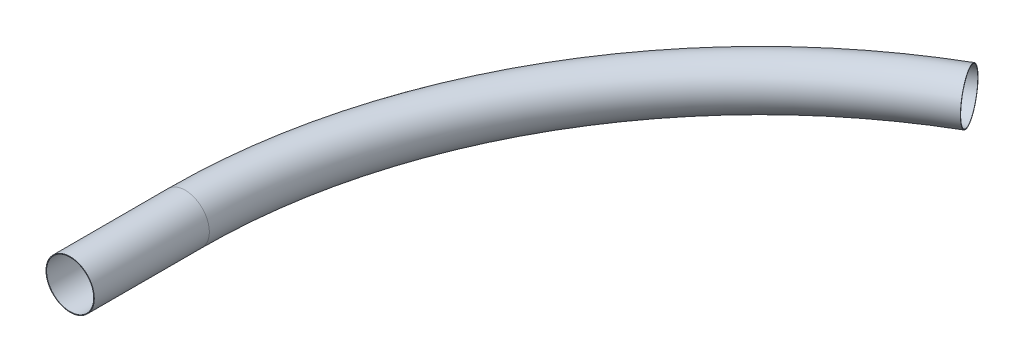
ISO-10303-21;
HEADER;
FILE_DESCRIPTION(('STEP AP214'),'2;1');
FILE_NAME('part.step','',(''),(''),'','','');
FILE_SCHEMA(('AUTOMOTIVE_DESIGN { 1 0 10303 214 1 1 1 1 }'));
ENDSEC;
DATA;
#1=APPLICATION_CONTEXT('core data for automotive mechanical design processes');
#2=APPLICATION_PROTOCOL_DEFINITION('international standard','automotive_design',2000,#1);
#3=PRODUCT_CONTEXT('',#1,'mechanical');
#4=PRODUCT('Part','Part','',(#3));
#5=PRODUCT_RELATED_PRODUCT_CATEGORY('part','',(#4));
#6=PRODUCT_DEFINITION_FORMATION('','',#4);
#7=PRODUCT_DEFINITION_CONTEXT('part definition',#1,'design');
#8=PRODUCT_DEFINITION('design','',#6,#7);
#9=PRODUCT_DEFINITION_SHAPE('','',#8);
#10=(LENGTH_UNIT() NAMED_UNIT(*) SI_UNIT(.MILLI.,.METRE.));
#11=(NAMED_UNIT(*) PLANE_ANGLE_UNIT() SI_UNIT($,.RADIAN.));
#12=(NAMED_UNIT(*) SI_UNIT($,.STERADIAN.) SOLID_ANGLE_UNIT());
#13=UNCERTAINTY_MEASURE_WITH_UNIT(LENGTH_MEASURE(1.E-05),#10,'distance_accuracy_value','');
#14=(GEOMETRIC_REPRESENTATION_CONTEXT(3) GLOBAL_UNCERTAINTY_ASSIGNED_CONTEXT((#13)) GLOBAL_UNIT_ASSIGNED_CONTEXT((#10,
#11,#12)) REPRESENTATION_CONTEXT('',''));
#15=CARTESIAN_POINT('',(0.,0.,0.));
#16=DIRECTION('',(0.,0.,1.));
#17=DIRECTION('',(1.,0.,0.));
#18=AXIS2_PLACEMENT_3D('',#15,#16,#17);
#19=CARTESIAN_POINT('',(0.,0.,0.));
#20=DIRECTION('',(0.,0.,-1.));
#21=DIRECTION('',(-1.,0.,0.));
#22=AXIS2_PLACEMENT_3D('',#19,#20,#21);
#23=CYLINDRICAL_SURFACE('',#22,210.);
#24=CARTESIAN_POINT('',(0.,0.,-1000.));
#25=DIRECTION('',(0.,0.,1.));
#26=DIRECTION('',(1.,0.,0.));
#27=AXIS2_PLACEMENT_3D('',#24,#25,#26);
#28=CIRCLE('',#27,210.);
#29=CARTESIAN_POINT('',(-210.,0.,-1000.));
#30=VERTEX_POINT('',#29);
#31=EDGE_CURVE('E43',#30,#30,#28,.T.);
#32=ORIENTED_EDGE('',*,*,#31,.T.);
#33=EDGE_LOOP('',(#32));
#34=FACE_BOUND('',#33,.T.);
#35=CARTESIAN_POINT('',(0.,0.,0.));
#36=DIRECTION('',(0.,0.,1.));
#37=DIRECTION('',(1.,0.,0.));
#38=AXIS2_PLACEMENT_3D('',#35,#36,#37);
#39=CIRCLE('',#38,210.);
#40=CARTESIAN_POINT('',(210.,0.,0.));
#41=VERTEX_POINT('',#40);
#42=EDGE_CURVE('E61',#41,#41,#39,.T.);
#43=ORIENTED_EDGE('',*,*,#42,.F.);
#44=EDGE_LOOP('',(#43));
#45=FACE_BOUND('',#44,.T.);
#46=ADVANCED_FACE('F39',(#34,#45),#23,.T.);
#47=CARTESIAN_POINT('',(5000.,0.,-1000.));
#48=DIRECTION('',(0.,-1.,0.));
#49=DIRECTION('',(0.,0.,-1.));
#50=AXIS2_PLACEMENT_3D('',#47,#48,#49);
#51=TOROIDAL_SURFACE('',#50,5000.,210.);
#52=CARTESIAN_POINT('',(2491.52335253138,0.,-5325.22194911482));
#53=DIRECTION('',(-0.865044389822963,0.,0.501695329493725));
#54=DIRECTION('',(0.501695329493725,0.,0.865044389822963));
#55=AXIS2_PLACEMENT_3D('',#52,#53,#54);
#56=CIRCLE('',#55,210.);
#57=CARTESIAN_POINT('',(2386.16733333769,0.,-5506.88127097764));
#58=VERTEX_POINT('',#57);
#59=EDGE_CURVE('E58',#58,#58,#56,.T.);
#60=CARTESIAN_POINT('',(5000.,0.,-1000.));
#61=DIRECTION('',(0.,-1.,0.));
#62=DIRECTION('',(0.,0.,-1.));
#63=AXIS2_PLACEMENT_3D('',#60,#61,#62);
#64=CIRCLE('',#63,5210.);
#65=EDGE_CURVE('',#30,#58,#64,.T.);
#66=ORIENTED_EDGE('',*,*,#31,.F.);
#67=ORIENTED_EDGE('',*,*,#59,.T.);
#68=ORIENTED_EDGE('',*,*,#65,.T.);
#69=ORIENTED_EDGE('',*,*,#65,.F.);
#70=EDGE_LOOP('',(#66,#68,#67,#69));
#71=FACE_BOUND('',#70,.T.);
#72=ADVANCED_FACE('F41',(#71),#51,.T.);
#73=CARTESIAN_POINT('',(0.,0.,0.));
#74=DIRECTION('',(0.,0.,1.));
#75=DIRECTION('',(1.,0.,0.));
#76=AXIS2_PLACEMENT_3D('',#73,#74,#75);
#77=PLANE('',#76);
#78=CARTESIAN_POINT('',(0.,0.,0.));
#79=DIRECTION('',(0.,0.,1.));
#80=DIRECTION('',(1.,0.,0.));
#81=AXIS2_PLACEMENT_3D('',#78,#79,#80);
#82=CIRCLE('',#81,205.);
#83=CARTESIAN_POINT('',(205.,0.,0.));
#84=VERTEX_POINT('',#83);
#85=EDGE_CURVE('E54',#84,#84,#82,.F.);
#86=ORIENTED_EDGE('',*,*,#85,.T.);
#87=EDGE_LOOP('',(#86));
#88=FACE_BOUND('',#87,.T.);
#89=ORIENTED_EDGE('',*,*,#42,.T.);
#90=EDGE_LOOP('',(#89));
#91=FACE_BOUND('',#90,.T.);
#92=ADVANCED_FACE('F73',(#88,#91),#77,.T.);
#93=CARTESIAN_POINT('',(2491.52335253138,0.,-5325.22194911482));
#94=DIRECTION('',(-0.865044389822963,0.,0.501695329493725));
#95=DIRECTION('',(0.501695329493725,0.,0.865044389822963));
#96=AXIS2_PLACEMENT_3D('',#93,#94,#95);
#97=PLANE('',#96);
#98=CARTESIAN_POINT('',(2491.52335253138,0.,-5325.22194911482));
#99=DIRECTION('',(-0.865044389822963,0.,0.501695329493725));
#100=DIRECTION('',(0.501695329493725,0.,0.865044389822963));
#101=AXIS2_PLACEMENT_3D('',#98,#99,#100);
#102=CIRCLE('',#101,205.);
#103=CARTESIAN_POINT('',(2388.67580998516,0.,-5502.55604902852));
#104=VERTEX_POINT('',#103);
#105=EDGE_CURVE('E10',#104,#104,#102,.F.);
#106=ORIENTED_EDGE('',*,*,#105,.F.);
#107=EDGE_LOOP('',(#106));
#108=FACE_BOUND('',#107,.T.);
#109=ORIENTED_EDGE('',*,*,#59,.F.);
#110=EDGE_LOOP('',(#109));
#111=FACE_BOUND('',#110,.T.);
#112=ADVANCED_FACE('F79',(#108,#111),#97,.F.);
#113=CARTESIAN_POINT('',(0.,0.,0.));
#114=DIRECTION('',(0.,0.,-1.));
#115=DIRECTION('',(-1.,0.,0.));
#116=AXIS2_PLACEMENT_3D('',#113,#114,#115);
#117=CYLINDRICAL_SURFACE('',#116,205.);
#118=CARTESIAN_POINT('',(0.,0.,-1000.));
#119=DIRECTION('',(0.,0.,1.));
#120=DIRECTION('',(1.,0.,0.));
#121=AXIS2_PLACEMENT_3D('',#118,#119,#120);
#122=CIRCLE('',#121,205.);
#123=CARTESIAN_POINT('',(-205.,0.,-1000.));
#124=VERTEX_POINT('',#123);
#125=EDGE_CURVE('E48',#124,#124,#122,.F.);
#126=ORIENTED_EDGE('',*,*,#125,.T.);
#127=EDGE_LOOP('',(#126));
#128=FACE_BOUND('',#127,.T.);
#129=ORIENTED_EDGE('',*,*,#85,.F.);
#130=EDGE_LOOP('',(#129));
#131=FACE_BOUND('',#130,.T.);
#132=ADVANCED_FACE('F84',(#128,#131),#117,.F.);
#133=CARTESIAN_POINT('',(5000.,0.,-1000.));
#134=DIRECTION('',(0.,-1.,0.));
#135=DIRECTION('',(0.,0.,-1.));
#136=AXIS2_PLACEMENT_3D('',#133,#134,#135);
#137=TOROIDAL_SURFACE('',#136,5000.,205.);
#138=CARTESIAN_POINT('',(5000.,0.,-1000.));
#139=DIRECTION('',(0.,-1.,0.));
#140=DIRECTION('',(0.,0.,-1.));
#141=AXIS2_PLACEMENT_3D('',#138,#139,#140);
#142=CIRCLE('',#141,5205.);
#143=EDGE_CURVE('',#124,#104,#142,.T.);
#144=ORIENTED_EDGE('',*,*,#125,.F.);
#145=ORIENTED_EDGE('',*,*,#105,.T.);
#146=ORIENTED_EDGE('',*,*,#143,.T.);
#147=ORIENTED_EDGE('',*,*,#143,.F.);
#148=EDGE_LOOP('',(#144,#146,#145,#147));
#149=FACE_BOUND('',#148,.T.);
#150=ADVANCED_FACE('F82',(#149),#137,.F.);
#151=CLOSED_SHELL('',(#46,#72,#92,#112,#132,#150));
#152=MANIFOLD_SOLID_BREP('B2',#151);
#153=ADVANCED_BREP_SHAPE_REPRESENTATION('',(#18,#152),#14);
#154=SHAPE_DEFINITION_REPRESENTATION(#9,#153);
ENDSEC;
END-ISO-10303-21;
